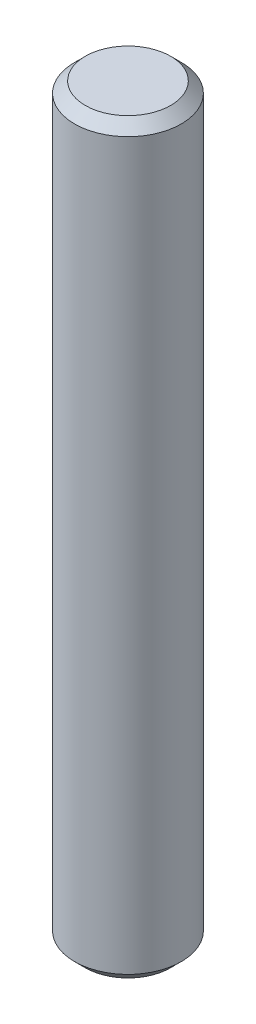
ISO-10303-21;
HEADER;
FILE_DESCRIPTION(('STEP AP214'),'2;1');
FILE_NAME('part.step','',(''),(''),'','','');
FILE_SCHEMA(('AUTOMOTIVE_DESIGN { 1 0 10303 214 1 1 1 1 }'));
ENDSEC;
DATA;
#1=APPLICATION_CONTEXT('core data for automotive mechanical design processes');
#2=APPLICATION_PROTOCOL_DEFINITION('international standard','automotive_design',2000,#1);
#3=PRODUCT_CONTEXT('',#1,'mechanical');
#4=PRODUCT('Part','Part','',(#3));
#5=PRODUCT_RELATED_PRODUCT_CATEGORY('part','',(#4));
#6=PRODUCT_DEFINITION_FORMATION('','',#4);
#7=PRODUCT_DEFINITION_CONTEXT('part definition',#1,'design');
#8=PRODUCT_DEFINITION('design','',#6,#7);
#9=PRODUCT_DEFINITION_SHAPE('','',#8);
#10=(LENGTH_UNIT() NAMED_UNIT(*) SI_UNIT(.MILLI.,.METRE.));
#11=(NAMED_UNIT(*) PLANE_ANGLE_UNIT() SI_UNIT($,.RADIAN.));
#12=(NAMED_UNIT(*) SI_UNIT($,.STERADIAN.) SOLID_ANGLE_UNIT());
#13=UNCERTAINTY_MEASURE_WITH_UNIT(LENGTH_MEASURE(1.E-05),#10,'distance_accuracy_value','');
#14=(GEOMETRIC_REPRESENTATION_CONTEXT(3) GLOBAL_UNCERTAINTY_ASSIGNED_CONTEXT((#13)) GLOBAL_UNIT_ASSIGNED_CONTEXT((#10,
#11,#12)) REPRESENTATION_CONTEXT('',''));
#15=CARTESIAN_POINT('',(0.,0.,0.));
#16=DIRECTION('',(0.,0.,1.));
#17=DIRECTION('',(1.,0.,0.));
#18=AXIS2_PLACEMENT_3D('',#15,#16,#17);
#19=CARTESIAN_POINT('',(0.,44.45,0.));
#20=DIRECTION('',(0.,-1.,0.));
#21=DIRECTION('',(0.,0.,-1.));
#22=AXIS2_PLACEMENT_3D('',#19,#20,#21);
#23=CYLINDRICAL_SURFACE('',#22,3.175);
#24=CARTESIAN_POINT('',(0.,0.635000000000004,0.));
#25=DIRECTION('',(0.,1.,0.));
#26=DIRECTION('',(0.,0.,1.));
#27=AXIS2_PLACEMENT_3D('',#24,#25,#26);
#28=CIRCLE('',#27,3.175);
#29=CARTESIAN_POINT('',(0.,0.635000000000004,3.175));
#30=VERTEX_POINT('',#29);
#31=EDGE_CURVE('E61',#30,#30,#28,.T.);
#32=ORIENTED_EDGE('',*,*,#31,.T.);
#33=EDGE_LOOP('',(#32));
#34=FACE_BOUND('',#33,.T.);
#35=CARTESIAN_POINT('',(0.,43.815,0.));
#36=DIRECTION('',(0.,1.,0.));
#37=DIRECTION('',(0.,0.,1.));
#38=AXIS2_PLACEMENT_3D('',#35,#36,#37);
#39=CIRCLE('',#38,3.175);
#40=CARTESIAN_POINT('',(0.,43.815,3.175));
#41=VERTEX_POINT('',#40);
#42=EDGE_CURVE('E66',#41,#41,#39,.F.);
#43=ORIENTED_EDGE('',*,*,#42,.T.);
#44=EDGE_LOOP('',(#43));
#45=FACE_BOUND('',#44,.T.);
#46=ADVANCED_FACE('F47',(#34,#45),#23,.T.);
#47=CARTESIAN_POINT('',(0.,44.45,0.));
#48=DIRECTION('',(0.,1.,0.));
#49=DIRECTION('',(0.,0.,1.));
#50=AXIS2_PLACEMENT_3D('',#47,#48,#49);
#51=PLANE('',#50);
#52=CARTESIAN_POINT('',(0.,44.45,0.));
#53=DIRECTION('',(0.,1.,0.));
#54=DIRECTION('',(0.,0.,1.));
#55=AXIS2_PLACEMENT_3D('',#52,#53,#54);
#56=CIRCLE('',#55,2.54);
#57=CARTESIAN_POINT('',(0.,44.45,2.54));
#58=VERTEX_POINT('',#57);
#59=EDGE_CURVE('E10',#58,#58,#56,.T.);
#60=ORIENTED_EDGE('',*,*,#59,.T.);
#61=EDGE_LOOP('',(#60));
#62=FACE_BOUND('',#61,.T.);
#63=ADVANCED_FACE('F83',(#62),#51,.T.);
#64=CARTESIAN_POINT('',(0.,0.,0.));
#65=DIRECTION('',(0.,1.,0.));
#66=DIRECTION('',(0.,0.,1.));
#67=AXIS2_PLACEMENT_3D('',#64,#65,#66);
#68=PLANE('',#67);
#69=CARTESIAN_POINT('',(0.,0.,0.));
#70=DIRECTION('',(0.,1.,0.));
#71=DIRECTION('',(0.,0.,1.));
#72=AXIS2_PLACEMENT_3D('',#69,#70,#71);
#73=CIRCLE('',#72,2.54);
#74=CARTESIAN_POINT('',(0.,0.,2.54));
#75=VERTEX_POINT('',#74);
#76=EDGE_CURVE('E56',#75,#75,#73,.F.);
#77=ORIENTED_EDGE('',*,*,#76,.T.);
#78=EDGE_LOOP('',(#77));
#79=FACE_BOUND('',#78,.T.);
#80=ADVANCED_FACE('F80',(#79),#68,.F.);
#81=CARTESIAN_POINT('',(0.,0.635000000000004,0.));
#82=DIRECTION('',(0.,1.,0.));
#83=DIRECTION('',(0.,0.,1.));
#84=AXIS2_PLACEMENT_3D('',#81,#82,#83);
#85=CONICAL_SURFACE('',#84,3.175,0.785398163397447);
#86=ORIENTED_EDGE('',*,*,#76,.F.);
#87=EDGE_LOOP('',(#86));
#88=FACE_BOUND('',#87,.T.);
#89=ORIENTED_EDGE('',*,*,#31,.F.);
#90=EDGE_LOOP('',(#89));
#91=FACE_BOUND('',#90,.T.);
#92=ADVANCED_FACE('F76',(#88,#91),#85,.T.);
#93=CARTESIAN_POINT('',(0.,44.45,0.));
#94=DIRECTION('',(0.,-1.,0.));
#95=DIRECTION('',(0.,0.,-1.));
#96=AXIS2_PLACEMENT_3D('',#93,#94,#95);
#97=CONICAL_SURFACE('',#96,2.54,0.785398163397445);
#98=ORIENTED_EDGE('',*,*,#42,.F.);
#99=EDGE_LOOP('',(#98));
#100=FACE_BOUND('',#99,.T.);
#101=ORIENTED_EDGE('',*,*,#59,.F.);
#102=EDGE_LOOP('',(#101));
#103=FACE_BOUND('',#102,.T.);
#104=ADVANCED_FACE('F50',(#100,#103),#97,.T.);
#105=CLOSED_SHELL('',(#46,#63,#80,#92,#104));
#106=MANIFOLD_SOLID_BREP('B2',#105);
#107=ADVANCED_BREP_SHAPE_REPRESENTATION('',(#18,#106),#14);
#108=SHAPE_DEFINITION_REPRESENTATION(#9,#107);
ENDSEC;
END-ISO-10303-21;
